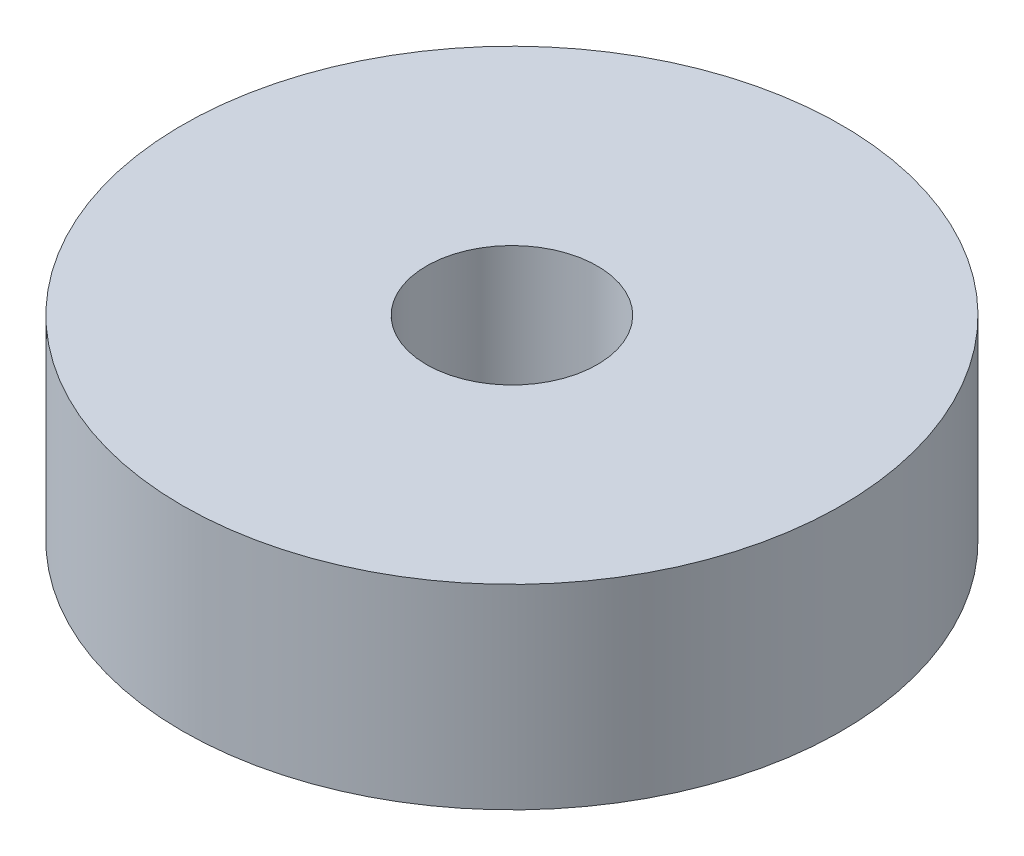
ISO-10303-21;
HEADER;
FILE_DESCRIPTION(('STEP AP214'),'2;1');
FILE_NAME('part.step','',(''),(''),'','','');
FILE_SCHEMA(('AUTOMOTIVE_DESIGN { 1 0 10303 214 1 1 1 1 }'));
ENDSEC;
DATA;
#1=APPLICATION_CONTEXT('core data for automotive mechanical design processes');
#2=APPLICATION_PROTOCOL_DEFINITION('international standard','automotive_design',2000,#1);
#3=PRODUCT_CONTEXT('',#1,'mechanical');
#4=PRODUCT('Part','Part','',(#3));
#5=PRODUCT_RELATED_PRODUCT_CATEGORY('part','',(#4));
#6=PRODUCT_DEFINITION_FORMATION('','',#4);
#7=PRODUCT_DEFINITION_CONTEXT('part definition',#1,'design');
#8=PRODUCT_DEFINITION('design','',#6,#7);
#9=PRODUCT_DEFINITION_SHAPE('','',#8);
#10=(LENGTH_UNIT() NAMED_UNIT(*) SI_UNIT(.MILLI.,.METRE.));
#11=(NAMED_UNIT(*) PLANE_ANGLE_UNIT() SI_UNIT($,.RADIAN.));
#12=(NAMED_UNIT(*) SI_UNIT($,.STERADIAN.) SOLID_ANGLE_UNIT());
#13=UNCERTAINTY_MEASURE_WITH_UNIT(LENGTH_MEASURE(1.E-05),#10,'distance_accuracy_value','');
#14=(GEOMETRIC_REPRESENTATION_CONTEXT(3) GLOBAL_UNCERTAINTY_ASSIGNED_CONTEXT((#13)) GLOBAL_UNIT_ASSIGNED_CONTEXT((#10,
#11,#12)) REPRESENTATION_CONTEXT('',''));
#15=CARTESIAN_POINT('',(0.,0.,0.));
#16=DIRECTION('',(0.,0.,1.));
#17=DIRECTION('',(1.,0.,0.));
#18=AXIS2_PLACEMENT_3D('',#15,#16,#17);
#19=CARTESIAN_POINT('',(0.,4.,0.));
#20=DIRECTION('',(0.,1.,0.));
#21=DIRECTION('',(0.,0.,1.));
#22=AXIS2_PLACEMENT_3D('',#19,#20,#21);
#23=PLANE('',#22);
#24=CARTESIAN_POINT('',(0.,4.,0.));
#25=DIRECTION('',(0.,1.,0.));
#26=DIRECTION('',(0.,0.,1.));
#27=AXIS2_PLACEMENT_3D('',#24,#25,#26);
#28=CIRCLE('',#27,6.75);
#29=CARTESIAN_POINT('',(0.,4.,6.75));
#30=VERTEX_POINT('',#29);
#31=EDGE_CURVE('E10',#30,#30,#28,.T.);
#32=ORIENTED_EDGE('',*,*,#31,.T.);
#33=EDGE_LOOP('',(#32));
#34=FACE_BOUND('',#33,.T.);
#35=CARTESIAN_POINT('',(0.,4.,0.));
#36=DIRECTION('',(0.,1.,0.));
#37=DIRECTION('',(0.,0.,1.));
#38=AXIS2_PLACEMENT_3D('',#35,#36,#37);
#39=CIRCLE('',#38,1.75);
#40=CARTESIAN_POINT('',(0.,4.,1.75));
#41=VERTEX_POINT('',#40);
#42=EDGE_CURVE('E48',#41,#41,#39,.T.);
#43=ORIENTED_EDGE('',*,*,#42,.F.);
#44=EDGE_LOOP('',(#43));
#45=FACE_BOUND('',#44,.T.);
#46=ADVANCED_FACE('F37',(#34,#45),#23,.T.);
#47=CARTESIAN_POINT('',(0.,0.,0.));
#48=DIRECTION('',(0.,1.,0.));
#49=DIRECTION('',(0.,0.,1.));
#50=AXIS2_PLACEMENT_3D('',#47,#48,#49);
#51=PLANE('',#50);
#52=CARTESIAN_POINT('',(0.,0.,0.));
#53=DIRECTION('',(0.,1.,0.));
#54=DIRECTION('',(0.,0.,1.));
#55=AXIS2_PLACEMENT_3D('',#52,#53,#54);
#56=CIRCLE('',#55,6.75);
#57=CARTESIAN_POINT('',(0.,0.,6.75));
#58=VERTEX_POINT('',#57);
#59=EDGE_CURVE('E41',#58,#58,#56,.T.);
#60=ORIENTED_EDGE('',*,*,#59,.F.);
#61=EDGE_LOOP('',(#60));
#62=FACE_BOUND('',#61,.T.);
#63=CARTESIAN_POINT('',(0.,0.,0.));
#64=DIRECTION('',(0.,1.,0.));
#65=DIRECTION('',(0.,0.,1.));
#66=AXIS2_PLACEMENT_3D('',#63,#64,#65);
#67=CIRCLE('',#66,1.75);
#68=CARTESIAN_POINT('',(0.,0.,1.75));
#69=VERTEX_POINT('',#68);
#70=EDGE_CURVE('E50',#69,#69,#67,.T.);
#71=ORIENTED_EDGE('',*,*,#70,.T.);
#72=EDGE_LOOP('',(#71));
#73=FACE_BOUND('',#72,.T.);
#74=ADVANCED_FACE('F60',(#62,#73),#51,.F.);
#75=CARTESIAN_POINT('',(0.,4.,0.));
#76=DIRECTION('',(0.,-1.,0.));
#77=DIRECTION('',(0.,0.,-1.));
#78=AXIS2_PLACEMENT_3D('',#75,#76,#77);
#79=CYLINDRICAL_SURFACE('',#78,6.75);
#80=ORIENTED_EDGE('',*,*,#31,.F.);
#81=EDGE_LOOP('',(#80));
#82=FACE_BOUND('',#81,.T.);
#83=ORIENTED_EDGE('',*,*,#59,.T.);
#84=EDGE_LOOP('',(#83));
#85=FACE_BOUND('',#84,.T.);
#86=ADVANCED_FACE('F39',(#82,#85),#79,.T.);
#87=CARTESIAN_POINT('',(0.,4.,0.));
#88=DIRECTION('',(0.,-1.,0.));
#89=DIRECTION('',(0.,0.,-1.));
#90=AXIS2_PLACEMENT_3D('',#87,#88,#89);
#91=CYLINDRICAL_SURFACE('',#90,1.75);
#92=ORIENTED_EDGE('',*,*,#42,.T.);
#93=EDGE_LOOP('',(#92));
#94=FACE_BOUND('',#93,.T.);
#95=ORIENTED_EDGE('',*,*,#70,.F.);
#96=EDGE_LOOP('',(#95));
#97=FACE_BOUND('',#96,.T.);
#98=ADVANCED_FACE('F56',(#94,#97),#91,.F.);
#99=CLOSED_SHELL('',(#46,#74,#86,#98));
#100=MANIFOLD_SOLID_BREP('B2',#99);
#101=ADVANCED_BREP_SHAPE_REPRESENTATION('',(#18,#100),#14);
#102=SHAPE_DEFINITION_REPRESENTATION(#9,#101);
ENDSEC;
END-ISO-10303-21;
